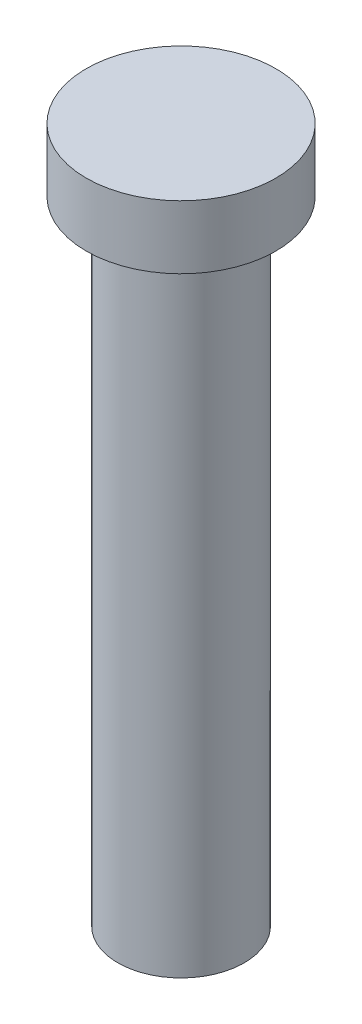
ISO-10303-21;
HEADER;
FILE_DESCRIPTION(('STEP AP214'),'2;1');
FILE_NAME('part.step','',(''),(''),'','','');
FILE_SCHEMA(('AUTOMOTIVE_DESIGN { 1 0 10303 214 1 1 1 1 }'));
ENDSEC;
DATA;
#1=APPLICATION_CONTEXT('core data for automotive mechanical design processes');
#2=APPLICATION_PROTOCOL_DEFINITION('international standard','automotive_design',2000,#1);
#3=PRODUCT_CONTEXT('',#1,'mechanical');
#4=PRODUCT('Part','Part','',(#3));
#5=PRODUCT_RELATED_PRODUCT_CATEGORY('part','',(#4));
#6=PRODUCT_DEFINITION_FORMATION('','',#4);
#7=PRODUCT_DEFINITION_CONTEXT('part definition',#1,'design');
#8=PRODUCT_DEFINITION('design','',#6,#7);
#9=PRODUCT_DEFINITION_SHAPE('','',#8);
#10=(LENGTH_UNIT() NAMED_UNIT(*) SI_UNIT(.MILLI.,.METRE.));
#11=(NAMED_UNIT(*) PLANE_ANGLE_UNIT() SI_UNIT($,.RADIAN.));
#12=(NAMED_UNIT(*) SI_UNIT($,.STERADIAN.) SOLID_ANGLE_UNIT());
#13=UNCERTAINTY_MEASURE_WITH_UNIT(LENGTH_MEASURE(1.E-05),#10,'distance_accuracy_value','');
#14=(GEOMETRIC_REPRESENTATION_CONTEXT(3) GLOBAL_UNCERTAINTY_ASSIGNED_CONTEXT((#13)) GLOBAL_UNIT_ASSIGNED_CONTEXT((#10,
#11,#12)) REPRESENTATION_CONTEXT('',''));
#15=CARTESIAN_POINT('',(0.,0.,0.));
#16=DIRECTION('',(0.,0.,1.));
#17=DIRECTION('',(1.,0.,0.));
#18=AXIS2_PLACEMENT_3D('',#15,#16,#17);
#19=CARTESIAN_POINT('',(0.,1.5,0.));
#20=DIRECTION('',(0.,-1.,0.));
#21=DIRECTION('',(0.,0.,-1.));
#22=AXIS2_PLACEMENT_3D('',#19,#20,#21);
#23=CYLINDRICAL_SURFACE('',#22,2.25);
#24=CARTESIAN_POINT('',(0.,1.5,0.));
#25=DIRECTION('',(0.,1.,0.));
#26=DIRECTION('',(0.,0.,1.));
#27=AXIS2_PLACEMENT_3D('',#24,#25,#26);
#28=CIRCLE('',#27,2.25);
#29=CARTESIAN_POINT('',(0.,1.5,2.25));
#30=VERTEX_POINT('',#29);
#31=EDGE_CURVE('E48',#30,#30,#28,.T.);
#32=ORIENTED_EDGE('',*,*,#31,.F.);
#33=EDGE_LOOP('',(#32));
#34=FACE_BOUND('',#33,.T.);
#35=CARTESIAN_POINT('',(0.,0.,0.));
#36=DIRECTION('',(0.,1.,0.));
#37=DIRECTION('',(0.,0.,1.));
#38=AXIS2_PLACEMENT_3D('',#35,#36,#37);
#39=CIRCLE('',#38,2.25);
#40=CARTESIAN_POINT('',(0.,0.,2.25));
#41=VERTEX_POINT('',#40);
#42=EDGE_CURVE('E44',#41,#41,#39,.T.);
#43=ORIENTED_EDGE('',*,*,#42,.T.);
#44=EDGE_LOOP('',(#43));
#45=FACE_BOUND('',#44,.T.);
#46=ADVANCED_FACE('F41',(#34,#45),#23,.T.);
#47=CARTESIAN_POINT('',(0.,1.5,0.));
#48=DIRECTION('',(0.,1.,0.));
#49=DIRECTION('',(0.,0.,1.));
#50=AXIS2_PLACEMENT_3D('',#47,#48,#49);
#51=PLANE('',#50);
#52=ORIENTED_EDGE('',*,*,#31,.T.);
#53=EDGE_LOOP('',(#52));
#54=FACE_BOUND('',#53,.T.);
#55=ADVANCED_FACE('F65',(#54),#51,.T.);
#56=CARTESIAN_POINT('',(0.,0.,0.));
#57=DIRECTION('',(0.,1.,0.));
#58=DIRECTION('',(0.,0.,1.));
#59=AXIS2_PLACEMENT_3D('',#56,#57,#58);
#60=PLANE('',#59);
#61=CARTESIAN_POINT('',(0.,0.,0.));
#62=DIRECTION('',(0.,-1.,0.));
#63=DIRECTION('',(0.,0.,-1.));
#64=AXIS2_PLACEMENT_3D('',#61,#62,#63);
#65=CIRCLE('',#64,1.5);
#66=CARTESIAN_POINT('',(0.,0.,-1.5));
#67=VERTEX_POINT('',#66);
#68=EDGE_CURVE('E10',#67,#67,#65,.T.);
#69=ORIENTED_EDGE('',*,*,#68,.F.);
#70=EDGE_LOOP('',(#69));
#71=FACE_BOUND('',#70,.T.);
#72=ORIENTED_EDGE('',*,*,#42,.F.);
#73=EDGE_LOOP('',(#72));
#74=FACE_BOUND('',#73,.T.);
#75=ADVANCED_FACE('F62',(#71,#74),#60,.F.);
#76=CARTESIAN_POINT('',(0.,-15.,0.));
#77=DIRECTION('',(0.,1.,0.));
#78=DIRECTION('',(0.,0.,1.));
#79=AXIS2_PLACEMENT_3D('',#76,#77,#78);
#80=CYLINDRICAL_SURFACE('',#79,1.5);
#81=CARTESIAN_POINT('',(0.,-15.,0.));
#82=DIRECTION('',(0.,-1.,0.));
#83=DIRECTION('',(0.,0.,-1.));
#84=AXIS2_PLACEMENT_3D('',#81,#82,#83);
#85=CIRCLE('',#84,1.5);
#86=CARTESIAN_POINT('',(0.,-15.,-1.5));
#87=VERTEX_POINT('',#86);
#88=EDGE_CURVE('E54',#87,#87,#85,.T.);
#89=ORIENTED_EDGE('',*,*,#88,.F.);
#90=EDGE_LOOP('',(#89));
#91=FACE_BOUND('',#90,.T.);
#92=ORIENTED_EDGE('',*,*,#68,.T.);
#93=EDGE_LOOP('',(#92));
#94=FACE_BOUND('',#93,.T.);
#95=ADVANCED_FACE('F64',(#91,#94),#80,.T.);
#96=CARTESIAN_POINT('',(0.,-15.,0.));
#97=DIRECTION('',(0.,-1.,0.));
#98=DIRECTION('',(0.,0.,-1.));
#99=AXIS2_PLACEMENT_3D('',#96,#97,#98);
#100=PLANE('',#99);
#101=ORIENTED_EDGE('',*,*,#88,.T.);
#102=EDGE_LOOP('',(#101));
#103=FACE_BOUND('',#102,.T.);
#104=ADVANCED_FACE('F71',(#103),#100,.T.);
#105=CLOSED_SHELL('',(#46,#55,#75,#95,#104));
#106=MANIFOLD_SOLID_BREP('B2',#105);
#107=ADVANCED_BREP_SHAPE_REPRESENTATION('',(#18,#106),#14);
#108=SHAPE_DEFINITION_REPRESENTATION(#9,#107);
ENDSEC;
END-ISO-10303-21;
